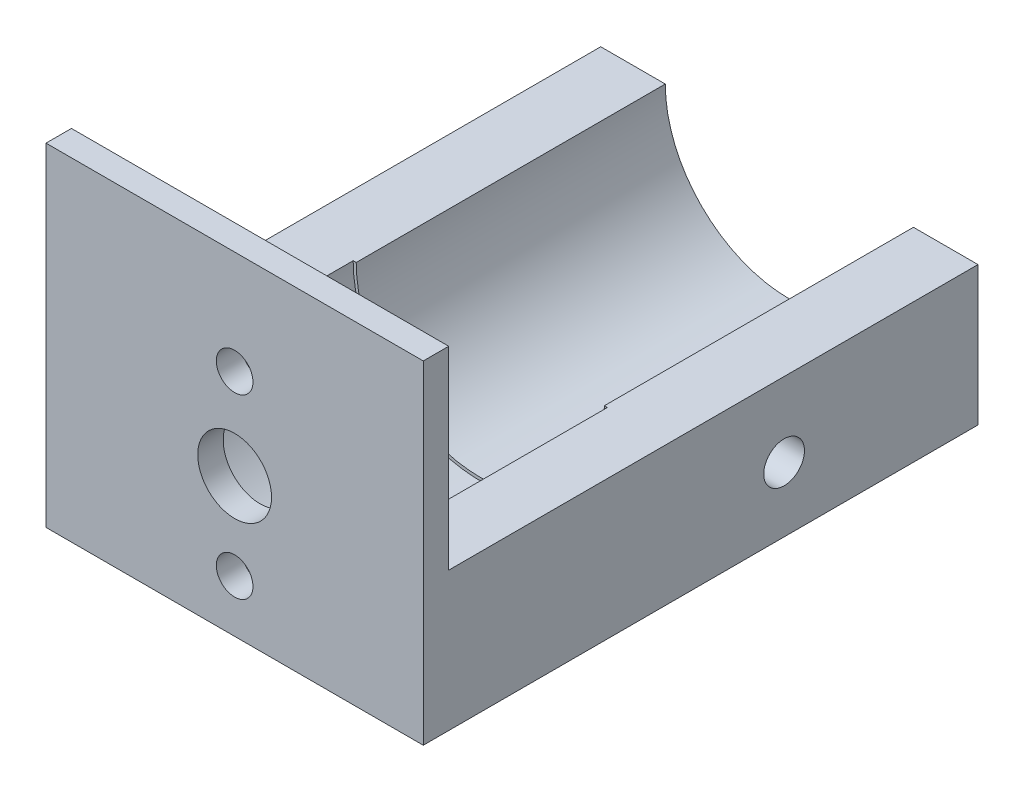
ISO-10303-21;
HEADER;
FILE_DESCRIPTION(('STEP AP214'),'2;1');
FILE_NAME('part.step','',(''),(''),'','','');
FILE_SCHEMA(('AUTOMOTIVE_DESIGN { 1 0 10303 214 1 1 1 1 }'));
ENDSEC;
DATA;
#1=APPLICATION_CONTEXT('core data for automotive mechanical design processes');
#2=APPLICATION_PROTOCOL_DEFINITION('international standard','automotive_design',2000,#1);
#3=PRODUCT_CONTEXT('',#1,'mechanical');
#4=PRODUCT('Part','Part','',(#3));
#5=PRODUCT_RELATED_PRODUCT_CATEGORY('part','',(#4));
#6=PRODUCT_DEFINITION_FORMATION('','',#4);
#7=PRODUCT_DEFINITION_CONTEXT('part definition',#1,'design');
#8=PRODUCT_DEFINITION('design','',#6,#7);
#9=PRODUCT_DEFINITION_SHAPE('','',#8);
#10=(LENGTH_UNIT() NAMED_UNIT(*) SI_UNIT(.MILLI.,.METRE.));
#11=(NAMED_UNIT(*) PLANE_ANGLE_UNIT() SI_UNIT($,.RADIAN.));
#12=(NAMED_UNIT(*) SI_UNIT($,.STERADIAN.) SOLID_ANGLE_UNIT());
#13=UNCERTAINTY_MEASURE_WITH_UNIT(LENGTH_MEASURE(1.E-05),#10,'distance_accuracy_value','');
#14=(GEOMETRIC_REPRESENTATION_CONTEXT(3) GLOBAL_UNCERTAINTY_ASSIGNED_CONTEXT((#13)) GLOBAL_UNIT_ASSIGNED_CONTEXT((#10,
#11,#12)) REPRESENTATION_CONTEXT('',''));
#15=CARTESIAN_POINT('',(0.,0.,0.));
#16=DIRECTION('',(0.,0.,1.));
#17=DIRECTION('',(1.,0.,0.));
#18=AXIS2_PLACEMENT_3D('',#15,#16,#17);
#19=CARTESIAN_POINT('',(5.23144906663831,19.05,30.364999976));
#20=DIRECTION('',(0.,0.,-1.));
#21=DIRECTION('',(-1.,0.,0.));
#22=AXIS2_PLACEMENT_3D('',#19,#20,#21);
#23=PLANE('',#22);
#24=CARTESIAN_POINT('',(5.23144901202831,19.05,30.364999976));
#25=DIRECTION('',(0.,0.,-1.));
#26=DIRECTION('',(-1.,0.,0.));
#27=AXIS2_PLACEMENT_3D('',#24,#25,#26);
#28=CIRCLE('',#27,12.4903981382124);
#29=CARTESIAN_POINT('',(17.7218471502407,19.05,30.364999976));
#30=VERTEX_POINT('',#29);
#31=CARTESIAN_POINT('',(-7.25894912618406,19.05,30.364999976));
#32=VERTEX_POINT('',#31);
#33=EDGE_CURVE('E58',#30,#32,#28,.T.);
#34=ORIENTED_EDGE('',*,*,#33,.F.);
#35=DIRECTION('',(-1.,0.,0.));
#36=VECTOR('',#35,1.);
#37=CARTESIAN_POINT('',(23.7638472582407,19.05,30.364999976));
#38=LINE('',#37,#36);
#39=CARTESIAN_POINT('',(17.4218472574807,19.05,30.364999976));
#40=VERTEX_POINT('',#39);
#41=EDGE_CURVE('E63',#30,#40,#38,.T.);
#42=ORIENTED_EDGE('',*,*,#41,.T.);
#43=CARTESIAN_POINT('',(5.23144906663831,19.05,30.364999976));
#44=DIRECTION('',(0.,0.,-1.));
#45=DIRECTION('',(-1.,0.,0.));
#46=AXIS2_PLACEMENT_3D('',#43,#44,#45);
#47=CIRCLE('',#46,12.1903981908424);
#48=CARTESIAN_POINT('',(-6.95894912420406,19.05,30.364999976));
#49=VERTEX_POINT('',#48);
#50=EDGE_CURVE('E100',#40,#49,#47,.T.);
#51=ORIENTED_EDGE('',*,*,#50,.T.);
#52=DIRECTION('',(-1.,0.,0.));
#53=VECTOR('',#52,1.);
#54=CARTESIAN_POINT('',(-13.3009491249641,19.05,30.364999976));
#55=LINE('',#54,#53);
#56=EDGE_CURVE('E195',#49,#32,#55,.T.);
#57=ORIENTED_EDGE('',*,*,#56,.T.);
#58=EDGE_LOOP('',(#34,#42,#51,#57));
#59=FACE_BOUND('',#58,.T.);
#60=ADVANCED_FACE('F43',(#59),#23,.F.);
#61=CARTESIAN_POINT('',(5.23144906663831,19.05,30.364999976));
#62=DIRECTION('',(0.,0.,-1.));
#63=DIRECTION('',(-1.,0.,0.));
#64=AXIS2_PLACEMENT_3D('',#61,#62,#63);
#65=CYLINDRICAL_SURFACE('',#64,12.1903981908424);
#66=CARTESIAN_POINT('',(5.23144906663831,19.05,0.));
#67=DIRECTION('',(0.,0.,-1.));
#68=DIRECTION('',(-1.,0.,0.));
#69=AXIS2_PLACEMENT_3D('',#66,#67,#68);
#70=CIRCLE('',#69,12.1903981908424);
#71=CARTESIAN_POINT('',(17.4218472574807,19.05,0.));
#72=VERTEX_POINT('',#71);
#73=CARTESIAN_POINT('',(-6.95894912420406,19.05,0.));
#74=VERTEX_POINT('',#73);
#75=EDGE_CURVE('E106',#72,#74,#70,.T.);
#76=ORIENTED_EDGE('',*,*,#75,.T.);
#77=DIRECTION('',(0.,0.,-1.));
#78=VECTOR('',#77,1.);
#79=CARTESIAN_POINT('',(-6.95894912420406,19.05,30.364999976));
#80=LINE('',#79,#78);
#81=EDGE_CURVE('E11',#49,#74,#80,.T.);
#82=ORIENTED_EDGE('',*,*,#81,.F.);
#83=ORIENTED_EDGE('',*,*,#50,.F.);
#84=DIRECTION('',(0.,0.,-1.));
#85=VECTOR('',#84,1.);
#86=CARTESIAN_POINT('',(17.4218472574807,19.05,30.364999976));
#87=LINE('',#86,#85);
#88=EDGE_CURVE('E92',#40,#72,#87,.T.);
#89=ORIENTED_EDGE('',*,*,#88,.T.);
#90=EDGE_LOOP('',(#76,#82,#83,#89));
#91=FACE_BOUND('',#90,.T.);
#92=ADVANCED_FACE('F45',(#91),#65,.F.);
#93=CARTESIAN_POINT('',(-13.3009491249641,19.05,30.364999976));
#94=DIRECTION('',(0.,-1.,0.));
#95=DIRECTION('',(0.,0.,-1.));
#96=AXIS2_PLACEMENT_3D('',#93,#94,#95);
#97=PLANE('',#96);
#98=DIRECTION('',(-1.,0.,0.));
#99=VECTOR('',#98,1.);
#100=CARTESIAN_POINT('',(-13.3009491249641,19.05,0.));
#101=LINE('',#100,#99);
#102=CARTESIAN_POINT('',(-13.3009491249641,19.05,0.));
#103=VERTEX_POINT('',#102);
#104=EDGE_CURVE('E110',#74,#103,#101,.T.);
#105=ORIENTED_EDGE('',*,*,#104,.T.);
#106=DIRECTION('',(0.,0.,-1.));
#107=VECTOR('',#106,1.);
#108=CARTESIAN_POINT('',(-13.3009491249641,19.05,30.364999976));
#109=LINE('',#108,#107);
#110=CARTESIAN_POINT('',(-13.3009491249641,19.05,51.999999886));
#111=VERTEX_POINT('',#110);
#112=EDGE_CURVE('E51',#111,#103,#109,.T.);
#113=ORIENTED_EDGE('',*,*,#112,.F.);
#114=DIRECTION('',(-1.,0.,0.));
#115=VECTOR('',#114,1.);
#116=CARTESIAN_POINT('',(-13.3009491249641,19.05,51.999999886));
#117=LINE('',#116,#115);
#118=CARTESIAN_POINT('',(-7.25894912618406,19.05,51.999999886));
#119=VERTEX_POINT('',#118);
#120=EDGE_CURVE('E184',#119,#111,#117,.T.);
#121=ORIENTED_EDGE('',*,*,#120,.F.);
#122=DIRECTION('',(0.,0.,-1.));
#123=VECTOR('',#122,1.);
#124=CARTESIAN_POINT('',(-7.25894912618406,19.05,51.999999886));
#125=LINE('',#124,#123);
#126=EDGE_CURVE('E116',#119,#32,#125,.T.);
#127=ORIENTED_EDGE('',*,*,#126,.T.);
#128=ORIENTED_EDGE('',*,*,#56,.F.);
#129=ORIENTED_EDGE('',*,*,#81,.T.);
#130=EDGE_LOOP('',(#105,#113,#121,#127,#128,#129));
#131=FACE_BOUND('',#130,.T.);
#132=ADVANCED_FACE('F203',(#131),#97,.F.);
#133=CARTESIAN_POINT('',(-13.3009491249641,19.05,30.364999976));
#134=DIRECTION('',(1.,0.,0.));
#135=DIRECTION('',(0.,1.,0.));
#136=AXIS2_PLACEMENT_3D('',#133,#134,#135);
#137=PLANE('',#136);
#138=CARTESIAN_POINT('',(-13.3009491249641,11.75,19.05));
#139=DIRECTION('',(-1.,0.,0.));
#140=DIRECTION('',(0.,-1.,0.));
#141=AXIS2_PLACEMENT_3D('',#138,#139,#140);
#142=CIRCLE('',#141,2.000000064);
#143=CARTESIAN_POINT('',(-13.3009491249641,9.749999936,19.05));
#144=VERTEX_POINT('',#143);
#145=EDGE_CURVE('E271',#144,#144,#142,.T.);
#146=ORIENTED_EDGE('',*,*,#145,.F.);
#147=EDGE_LOOP('',(#146));
#148=FACE_BOUND('',#147,.T.);
#149=DIRECTION('',(0.,-1.,0.));
#150=VECTOR('',#149,1.);
#151=CARTESIAN_POINT('',(-13.3009491249641,19.05,0.));
#152=LINE('',#151,#150);
#153=CARTESIAN_POINT('',(-13.3009491249641,5.4,0.));
#154=VERTEX_POINT('',#153);
#155=EDGE_CURVE('E113',#103,#154,#152,.T.);
#156=ORIENTED_EDGE('',*,*,#155,.T.);
#157=DIRECTION('',(0.,0.,-1.));
#158=VECTOR('',#157,1.);
#159=CARTESIAN_POINT('',(-13.3009491249641,5.4,30.364999976));
#160=LINE('',#159,#158);
#161=CARTESIAN_POINT('',(-13.3009491249641,5.4,54.499999886));
#162=VERTEX_POINT('',#161);
#163=EDGE_CURVE('E129',#162,#154,#160,.T.);
#164=ORIENTED_EDGE('',*,*,#163,.F.);
#165=DIRECTION('',(0.,-1.,0.));
#166=VECTOR('',#165,1.);
#167=CARTESIAN_POINT('',(-13.3009491249641,5.4,54.499999886));
#168=LINE('',#167,#166);
#169=CARTESIAN_POINT('',(-13.3009491249641,38.1,54.499999886));
#170=VERTEX_POINT('',#169);
#171=EDGE_CURVE('E171',#170,#162,#168,.T.);
#172=ORIENTED_EDGE('',*,*,#171,.F.);
#173=DIRECTION('',(0.,0.,-1.));
#174=VECTOR('',#173,1.);
#175=CARTESIAN_POINT('',(-13.3009491249641,38.1,54.499999886));
#176=LINE('',#175,#174);
#177=CARTESIAN_POINT('',(-13.3009491249641,38.1,51.999999886));
#178=VERTEX_POINT('',#177);
#179=EDGE_CURVE('E169',#170,#178,#176,.T.);
#180=ORIENTED_EDGE('',*,*,#179,.T.);
#181=DIRECTION('',(0.,-1.,0.));
#182=VECTOR('',#181,1.);
#183=CARTESIAN_POINT('',(-13.3009491249641,5.4,51.999999886));
#184=LINE('',#183,#182);
#185=EDGE_CURVE('E140',#178,#111,#184,.T.);
#186=ORIENTED_EDGE('',*,*,#185,.T.);
#187=ORIENTED_EDGE('',*,*,#112,.T.);
#188=EDGE_LOOP('',(#156,#164,#172,#180,#186,#187));
#189=FACE_BOUND('',#188,.T.);
#190=ADVANCED_FACE('F135',(#148,#189),#137,.F.);
#191=CARTESIAN_POINT('',(-13.3009491249641,5.4,30.364999976));
#192=DIRECTION('',(0.,1.,0.));
#193=DIRECTION('',(0.,0.,1.));
#194=AXIS2_PLACEMENT_3D('',#191,#192,#193);
#195=PLANE('',#194);
#196=CARTESIAN_POINT('',(18.6838472582407,5.4,48.149999886));
#197=DIRECTION('',(0.,-1.,0.));
#198=DIRECTION('',(0.,0.,-1.));
#199=AXIS2_PLACEMENT_3D('',#196,#197,#198);
#200=CIRCLE('',#199,2.);
#201=CARTESIAN_POINT('',(18.6838472582407,5.4,46.149999886));
#202=VERTEX_POINT('',#201);
#203=EDGE_CURVE('E250',#202,#202,#200,.T.);
#204=ORIENTED_EDGE('',*,*,#203,.F.);
#205=EDGE_LOOP('',(#204));
#206=FACE_BOUND('',#205,.T.);
#207=CARTESIAN_POINT('',(-8.22094912496406,5.4,6.35));
#208=DIRECTION('',(0.,-1.,0.));
#209=DIRECTION('',(0.,0.,-1.));
#210=AXIS2_PLACEMENT_3D('',#207,#208,#209);
#211=CIRCLE('',#210,2.);
#212=CARTESIAN_POINT('',(-8.22094912496406,5.4,4.35));
#213=VERTEX_POINT('',#212);
#214=EDGE_CURVE('E256',#213,#213,#211,.T.);
#215=ORIENTED_EDGE('',*,*,#214,.F.);
#216=EDGE_LOOP('',(#215));
#217=FACE_BOUND('',#216,.T.);
#218=CARTESIAN_POINT('',(18.6838472582407,5.4,6.35));
#219=DIRECTION('',(0.,-1.,0.));
#220=DIRECTION('',(0.,0.,-1.));
#221=AXIS2_PLACEMENT_3D('',#218,#219,#220);
#222=CIRCLE('',#221,2.);
#223=CARTESIAN_POINT('',(18.6838472582407,5.4,4.35));
#224=VERTEX_POINT('',#223);
#225=EDGE_CURVE('E257',#224,#224,#222,.T.);
#226=ORIENTED_EDGE('',*,*,#225,.F.);
#227=EDGE_LOOP('',(#226));
#228=FACE_BOUND('',#227,.T.);
#229=CARTESIAN_POINT('',(-8.22094912496406,5.4,48.149999886));
#230=DIRECTION('',(0.,-1.,0.));
#231=DIRECTION('',(0.,0.,-1.));
#232=AXIS2_PLACEMENT_3D('',#229,#230,#231);
#233=CIRCLE('',#232,2.);
#234=CARTESIAN_POINT('',(-8.22094912496406,5.4,46.149999886));
#235=VERTEX_POINT('',#234);
#236=EDGE_CURVE('E247',#235,#235,#233,.T.);
#237=ORIENTED_EDGE('',*,*,#236,.F.);
#238=EDGE_LOOP('',(#237));
#239=FACE_BOUND('',#238,.T.);
#240=DIRECTION('',(1.,0.,0.));
#241=VECTOR('',#240,1.);
#242=CARTESIAN_POINT('',(-13.3009491249641,5.4,0.));
#243=LINE('',#242,#241);
#244=CARTESIAN_POINT('',(23.7638472582407,5.4,0.));
#245=VERTEX_POINT('',#244);
#246=EDGE_CURVE('E122',#154,#245,#243,.T.);
#247=ORIENTED_EDGE('',*,*,#246,.T.);
#248=DIRECTION('',(0.,0.,-1.));
#249=VECTOR('',#248,1.);
#250=CARTESIAN_POINT('',(23.7638472582407,5.4,30.364999976));
#251=LINE('',#250,#249);
#252=CARTESIAN_POINT('',(23.7638472582407,5.4,54.499999886));
#253=VERTEX_POINT('',#252);
#254=EDGE_CURVE('E126',#253,#245,#251,.T.);
#255=ORIENTED_EDGE('',*,*,#254,.F.);
#256=DIRECTION('',(1.,0.,0.));
#257=VECTOR('',#256,1.);
#258=CARTESIAN_POINT('',(-13.3009491249641,5.4,54.499999886));
#259=LINE('',#258,#257);
#260=EDGE_CURVE('E167',#162,#253,#259,.T.);
#261=ORIENTED_EDGE('',*,*,#260,.F.);
#262=ORIENTED_EDGE('',*,*,#163,.T.);
#263=EDGE_LOOP('',(#247,#255,#261,#262));
#264=FACE_BOUND('',#263,.T.);
#265=ADVANCED_FACE('F147',(#206,#217,#228,#239,#264),#195,.F.);
#266=CARTESIAN_POINT('',(23.7638472582407,19.05,30.364999976));
#267=DIRECTION('',(-1.,0.,0.));
#268=DIRECTION('',(0.,-1.,0.));
#269=AXIS2_PLACEMENT_3D('',#266,#267,#268);
#270=PLANE('',#269);
#271=CARTESIAN_POINT('',(23.7638472582407,11.75,19.05));
#272=DIRECTION('',(1.,0.,0.));
#273=DIRECTION('',(0.,0.,-1.));
#274=AXIS2_PLACEMENT_3D('',#271,#272,#273);
#275=CIRCLE('',#274,2.);
#276=CARTESIAN_POINT('',(23.7638472582407,11.75,17.05));
#277=VERTEX_POINT('',#276);
#278=EDGE_CURVE('E277',#277,#277,#275,.T.);
#279=ORIENTED_EDGE('',*,*,#278,.F.);
#280=EDGE_LOOP('',(#279));
#281=FACE_BOUND('',#280,.T.);
#282=DIRECTION('',(0.,1.,0.));
#283=VECTOR('',#282,1.);
#284=CARTESIAN_POINT('',(23.7638472582407,19.05,0.));
#285=LINE('',#284,#283);
#286=CARTESIAN_POINT('',(23.7638472582407,19.05,0.));
#287=VERTEX_POINT('',#286);
#288=EDGE_CURVE('E101',#245,#287,#285,.T.);
#289=ORIENTED_EDGE('',*,*,#288,.T.);
#290=DIRECTION('',(0.,0.,-1.));
#291=VECTOR('',#290,1.);
#292=CARTESIAN_POINT('',(23.7638472582407,19.05,30.364999976));
#293=LINE('',#292,#291);
#294=CARTESIAN_POINT('',(23.7638472582407,19.05,51.999999886));
#295=VERTEX_POINT('',#294);
#296=EDGE_CURVE('E96',#295,#287,#293,.T.);
#297=ORIENTED_EDGE('',*,*,#296,.F.);
#298=DIRECTION('',(0.,1.,0.));
#299=VECTOR('',#298,1.);
#300=CARTESIAN_POINT('',(23.7638472582407,5.4,51.999999886));
#301=LINE('',#300,#299);
#302=CARTESIAN_POINT('',(23.7638472582407,38.1,51.999999886));
#303=VERTEX_POINT('',#302);
#304=EDGE_CURVE('E176',#295,#303,#301,.T.);
#305=ORIENTED_EDGE('',*,*,#304,.T.);
#306=DIRECTION('',(0.,0.,-1.));
#307=VECTOR('',#306,1.);
#308=CARTESIAN_POINT('',(23.7638472582407,38.1,54.499999886));
#309=LINE('',#308,#307);
#310=CARTESIAN_POINT('',(23.7638472582407,38.1,54.499999886));
#311=VERTEX_POINT('',#310);
#312=EDGE_CURVE('E160',#311,#303,#309,.T.);
#313=ORIENTED_EDGE('',*,*,#312,.F.);
#314=DIRECTION('',(0.,1.,0.));
#315=VECTOR('',#314,1.);
#316=CARTESIAN_POINT('',(23.7638472582407,5.4,54.499999886));
#317=LINE('',#316,#315);
#318=EDGE_CURVE('E156',#253,#311,#317,.T.);
#319=ORIENTED_EDGE('',*,*,#318,.F.);
#320=ORIENTED_EDGE('',*,*,#254,.T.);
#321=EDGE_LOOP('',(#289,#297,#305,#313,#319,#320));
#322=FACE_BOUND('',#321,.T.);
#323=ADVANCED_FACE('F153',(#281,#322),#270,.F.);
#324=CARTESIAN_POINT('',(23.7638472582407,19.05,30.364999976));
#325=DIRECTION('',(0.,-1.,0.));
#326=DIRECTION('',(0.,0.,-1.));
#327=AXIS2_PLACEMENT_3D('',#324,#325,#326);
#328=PLANE('',#327);
#329=DIRECTION('',(-1.,0.,0.));
#330=VECTOR('',#329,1.);
#331=CARTESIAN_POINT('',(23.7638472582407,19.05,0.));
#332=LINE('',#331,#330);
#333=EDGE_CURVE('E89',#287,#72,#332,.T.);
#334=ORIENTED_EDGE('',*,*,#333,.T.);
#335=ORIENTED_EDGE('',*,*,#88,.F.);
#336=ORIENTED_EDGE('',*,*,#41,.F.);
#337=DIRECTION('',(0.,0.,-1.));
#338=VECTOR('',#337,1.);
#339=CARTESIAN_POINT('',(17.7218471502407,19.05,51.999999886));
#340=LINE('',#339,#338);
#341=CARTESIAN_POINT('',(17.7218471502407,19.05,51.999999886));
#342=VERTEX_POINT('',#341);
#343=EDGE_CURVE('E111',#342,#30,#340,.T.);
#344=ORIENTED_EDGE('',*,*,#343,.F.);
#345=DIRECTION('',(-1.,0.,0.));
#346=VECTOR('',#345,1.);
#347=CARTESIAN_POINT('',(17.7218471502407,19.05,51.999999886));
#348=LINE('',#347,#346);
#349=EDGE_CURVE('E186',#295,#342,#348,.T.);
#350=ORIENTED_EDGE('',*,*,#349,.F.);
#351=ORIENTED_EDGE('',*,*,#296,.T.);
#352=EDGE_LOOP('',(#334,#335,#336,#344,#350,#351));
#353=FACE_BOUND('',#352,.T.);
#354=ADVANCED_FACE('F91',(#353),#328,.F.);
#355=CARTESIAN_POINT('',(5.23144906663831,19.05,0.));
#356=DIRECTION('',(0.,0.,-1.));
#357=DIRECTION('',(-1.,0.,0.));
#358=AXIS2_PLACEMENT_3D('',#355,#356,#357);
#359=PLANE('',#358);
#360=ORIENTED_EDGE('',*,*,#75,.F.);
#361=ORIENTED_EDGE('',*,*,#333,.F.);
#362=ORIENTED_EDGE('',*,*,#288,.F.);
#363=ORIENTED_EDGE('',*,*,#246,.F.);
#364=ORIENTED_EDGE('',*,*,#155,.F.);
#365=ORIENTED_EDGE('',*,*,#104,.F.);
#366=EDGE_LOOP('',(#360,#361,#362,#363,#364,#365));
#367=FACE_BOUND('',#366,.T.);
#368=ADVANCED_FACE('F108',(#367),#359,.T.);
#369=CARTESIAN_POINT('',(5.23144901202831,19.05,51.999999886));
#370=DIRECTION('',(0.,0.,-1.));
#371=DIRECTION('',(-1.,0.,0.));
#372=AXIS2_PLACEMENT_3D('',#369,#370,#371);
#373=CYLINDRICAL_SURFACE('',#372,12.4903981382124);
#374=ORIENTED_EDGE('',*,*,#33,.T.);
#375=ORIENTED_EDGE('',*,*,#126,.F.);
#376=CARTESIAN_POINT('',(5.23144901202831,19.05,51.999999886));
#377=DIRECTION('',(0.,0.,-1.));
#378=DIRECTION('',(-1.,0.,0.));
#379=AXIS2_PLACEMENT_3D('',#376,#377,#378);
#380=CIRCLE('',#379,12.4903981382124);
#381=EDGE_CURVE('E189',#342,#119,#380,.T.);
#382=ORIENTED_EDGE('',*,*,#381,.F.);
#383=ORIENTED_EDGE('',*,*,#343,.T.);
#384=EDGE_LOOP('',(#374,#375,#382,#383));
#385=FACE_BOUND('',#384,.T.);
#386=ADVANCED_FACE('F200',(#385),#373,.F.);
#387=CARTESIAN_POINT('',(0.,0.,51.999999886));
#388=DIRECTION('',(0.,0.,-1.));
#389=DIRECTION('',(-1.,0.,0.));
#390=AXIS2_PLACEMENT_3D('',#387,#388,#389);
#391=PLANE('',#390);
#392=CARTESIAN_POINT('',(5.23144909324068,10.541,51.999999886));
#393=DIRECTION('',(0.,0.,1.));
#394=DIRECTION('',(1.,0.,0.));
#395=AXIS2_PLACEMENT_3D('',#392,#393,#394);
#396=CIRCLE('',#395,1.8);
#397=CARTESIAN_POINT('',(7.03144909324068,10.541,51.999999886));
#398=VERTEX_POINT('',#397);
#399=EDGE_CURVE('E235',#398,#398,#396,.T.);
#400=ORIENTED_EDGE('',*,*,#399,.T.);
#401=EDGE_LOOP('',(#400));
#402=FACE_BOUND('',#401,.T.);
#403=CARTESIAN_POINT('',(5.23144909324067,19.05,51.999999886));
#404=DIRECTION('',(0.,0.,1.));
#405=DIRECTION('',(1.,0.,0.));
#406=AXIS2_PLACEMENT_3D('',#403,#404,#405);
#407=CIRCLE('',#406,3.625);
#408=CARTESIAN_POINT('',(8.85644909324068,19.05,51.999999886));
#409=VERTEX_POINT('',#408);
#410=EDGE_CURVE('E229',#409,#409,#407,.T.);
#411=ORIENTED_EDGE('',*,*,#410,.T.);
#412=EDGE_LOOP('',(#411));
#413=FACE_BOUND('',#412,.T.);
#414=CARTESIAN_POINT('',(5.23144909324067,27.94,51.999999886));
#415=DIRECTION('',(0.,0.,1.));
#416=DIRECTION('',(1.,0.,0.));
#417=AXIS2_PLACEMENT_3D('',#414,#415,#416);
#418=CIRCLE('',#417,1.8);
#419=CARTESIAN_POINT('',(7.03144909324067,27.94,51.999999886));
#420=VERTEX_POINT('',#419);
#421=EDGE_CURVE('E241',#420,#420,#418,.T.);
#422=ORIENTED_EDGE('',*,*,#421,.T.);
#423=EDGE_LOOP('',(#422));
#424=FACE_BOUND('',#423,.T.);
#425=ORIENTED_EDGE('',*,*,#381,.T.);
#426=ORIENTED_EDGE('',*,*,#120,.T.);
#427=ORIENTED_EDGE('',*,*,#185,.F.);
#428=DIRECTION('',(-1.,0.,0.));
#429=VECTOR('',#428,1.);
#430=CARTESIAN_POINT('',(-13.3009491249641,38.1,51.999999886));
#431=LINE('',#430,#429);
#432=EDGE_CURVE('E179',#303,#178,#431,.T.);
#433=ORIENTED_EDGE('',*,*,#432,.F.);
#434=ORIENTED_EDGE('',*,*,#304,.F.);
#435=ORIENTED_EDGE('',*,*,#349,.T.);
#436=EDGE_LOOP('',(#425,#426,#427,#433,#434,#435));
#437=FACE_BOUND('',#436,.T.);
#438=ADVANCED_FACE('F207',(#402,#413,#424,#437),#391,.T.);
#439=CARTESIAN_POINT('',(0.,0.,54.499999886));
#440=DIRECTION('',(0.,0.,-1.));
#441=DIRECTION('',(-1.,0.,0.));
#442=AXIS2_PLACEMENT_3D('',#439,#440,#441);
#443=PLANE('',#442);
#444=ORIENTED_EDGE('',*,*,#171,.T.);
#445=ORIENTED_EDGE('',*,*,#260,.T.);
#446=ORIENTED_EDGE('',*,*,#318,.T.);
#447=DIRECTION('',(-1.,0.,0.));
#448=VECTOR('',#447,1.);
#449=CARTESIAN_POINT('',(-13.3009491249641,38.1,54.499999886));
#450=LINE('',#449,#448);
#451=EDGE_CURVE('E166',#311,#170,#450,.T.);
#452=ORIENTED_EDGE('',*,*,#451,.T.);
#453=EDGE_LOOP('',(#444,#445,#446,#452));
#454=FACE_BOUND('',#453,.T.);
#455=CARTESIAN_POINT('',(5.23144909324067,19.05,54.499999886));
#456=DIRECTION('',(0.,0.,1.));
#457=DIRECTION('',(1.,0.,0.));
#458=AXIS2_PLACEMENT_3D('',#455,#456,#457);
#459=CIRCLE('',#458,3.625);
#460=CARTESIAN_POINT('',(8.85644909324068,19.05,54.499999886));
#461=VERTEX_POINT('',#460);
#462=EDGE_CURVE('E177',#461,#461,#459,.T.);
#463=ORIENTED_EDGE('',*,*,#462,.F.);
#464=EDGE_LOOP('',(#463));
#465=FACE_BOUND('',#464,.T.);
#466=CARTESIAN_POINT('',(5.23144909324068,10.541,54.499999886));
#467=DIRECTION('',(0.,0.,1.));
#468=DIRECTION('',(1.,0.,0.));
#469=AXIS2_PLACEMENT_3D('',#466,#467,#468);
#470=CIRCLE('',#469,1.8);
#471=CARTESIAN_POINT('',(7.03144909324068,10.541,54.499999886));
#472=VERTEX_POINT('',#471);
#473=EDGE_CURVE('E232',#472,#472,#470,.T.);
#474=ORIENTED_EDGE('',*,*,#473,.F.);
#475=EDGE_LOOP('',(#474));
#476=FACE_BOUND('',#475,.T.);
#477=CARTESIAN_POINT('',(5.23144909324067,27.94,54.499999886));
#478=DIRECTION('',(0.,0.,1.));
#479=DIRECTION('',(1.,0.,0.));
#480=AXIS2_PLACEMENT_3D('',#477,#478,#479);
#481=CIRCLE('',#480,1.8);
#482=CARTESIAN_POINT('',(7.03144909324067,27.94,54.499999886));
#483=VERTEX_POINT('',#482);
#484=EDGE_CURVE('E238',#483,#483,#481,.T.);
#485=ORIENTED_EDGE('',*,*,#484,.F.);
#486=EDGE_LOOP('',(#485));
#487=FACE_BOUND('',#486,.T.);
#488=ADVANCED_FACE('F224',(#454,#465,#476,#487),#443,.F.);
#489=CARTESIAN_POINT('',(-13.3009491249641,38.1,54.499999886));
#490=DIRECTION('',(0.,-1.,0.));
#491=DIRECTION('',(0.,0.,-1.));
#492=AXIS2_PLACEMENT_3D('',#489,#490,#491);
#493=PLANE('',#492);
#494=ORIENTED_EDGE('',*,*,#432,.T.);
#495=ORIENTED_EDGE('',*,*,#179,.F.);
#496=ORIENTED_EDGE('',*,*,#451,.F.);
#497=ORIENTED_EDGE('',*,*,#312,.T.);
#498=EDGE_LOOP('',(#494,#495,#496,#497));
#499=FACE_BOUND('',#498,.T.);
#500=ADVANCED_FACE('F219',(#499),#493,.F.);
#501=CARTESIAN_POINT('',(5.23144909324067,19.05,54.499999886));
#502=DIRECTION('',(0.,0.,-1.));
#503=DIRECTION('',(-1.,0.,0.));
#504=AXIS2_PLACEMENT_3D('',#501,#502,#503);
#505=CYLINDRICAL_SURFACE('',#504,3.625);
#506=ORIENTED_EDGE('',*,*,#462,.T.);
#507=EDGE_LOOP('',(#506));
#508=FACE_BOUND('',#507,.T.);
#509=ORIENTED_EDGE('',*,*,#410,.F.);
#510=EDGE_LOOP('',(#509));
#511=FACE_BOUND('',#510,.T.);
#512=ADVANCED_FACE('F327',(#508,#511),#505,.F.);
#513=CARTESIAN_POINT('',(5.23144909324068,10.541,54.499999886));
#514=DIRECTION('',(0.,0.,-1.));
#515=DIRECTION('',(-1.,0.,0.));
#516=AXIS2_PLACEMENT_3D('',#513,#514,#515);
#517=CYLINDRICAL_SURFACE('',#516,1.8);
#518=ORIENTED_EDGE('',*,*,#473,.T.);
#519=EDGE_LOOP('',(#518));
#520=FACE_BOUND('',#519,.T.);
#521=ORIENTED_EDGE('',*,*,#399,.F.);
#522=EDGE_LOOP('',(#521));
#523=FACE_BOUND('',#522,.T.);
#524=ADVANCED_FACE('F331',(#520,#523),#517,.F.);
#525=CARTESIAN_POINT('',(5.23144909324067,27.94,54.499999886));
#526=DIRECTION('',(0.,0.,-1.));
#527=DIRECTION('',(-1.,0.,0.));
#528=AXIS2_PLACEMENT_3D('',#525,#526,#527);
#529=CYLINDRICAL_SURFACE('',#528,1.8);
#530=ORIENTED_EDGE('',*,*,#484,.T.);
#531=EDGE_LOOP('',(#530));
#532=FACE_BOUND('',#531,.T.);
#533=ORIENTED_EDGE('',*,*,#421,.F.);
#534=EDGE_LOOP('',(#533));
#535=FACE_BOUND('',#534,.T.);
#536=ADVANCED_FACE('F336',(#532,#535),#529,.F.);
#537=CARTESIAN_POINT('',(-8.22094912496406,12.4,48.149999886));
#538=DIRECTION('',(0.,-1.,0.));
#539=DIRECTION('',(0.,0.,-1.));
#540=AXIS2_PLACEMENT_3D('',#537,#538,#539);
#541=CYLINDRICAL_SURFACE('',#540,2.);
#542=CARTESIAN_POINT('',(-8.22094912496406,12.4,48.149999886));
#543=DIRECTION('',(0.,-1.,0.));
#544=DIRECTION('',(0.,0.,-1.));
#545=AXIS2_PLACEMENT_3D('',#542,#543,#544);
#546=CIRCLE('',#545,2.);
#547=CARTESIAN_POINT('',(-8.22094912496406,12.4,46.149999886));
#548=VERTEX_POINT('',#547);
#549=EDGE_CURVE('E244',#548,#548,#546,.T.);
#550=ORIENTED_EDGE('',*,*,#549,.F.);
#551=EDGE_LOOP('',(#550));
#552=FACE_BOUND('',#551,.T.);
#553=ORIENTED_EDGE('',*,*,#236,.T.);
#554=EDGE_LOOP('',(#553));
#555=FACE_BOUND('',#554,.T.);
#556=ADVANCED_FACE('F343',(#552,#555),#541,.F.);
#557=CARTESIAN_POINT('',(-8.22094912496406,12.4,48.149999886));
#558=DIRECTION('',(0.,-1.,0.));
#559=DIRECTION('',(0.,0.,-1.));
#560=AXIS2_PLACEMENT_3D('',#557,#558,#559);
#561=PLANE('',#560);
#562=ORIENTED_EDGE('',*,*,#549,.T.);
#563=EDGE_LOOP('',(#562));
#564=FACE_BOUND('',#563,.T.);
#565=ADVANCED_FACE('F347',(#564),#561,.T.);
#566=CARTESIAN_POINT('',(18.6838472582407,12.4,6.35));
#567=DIRECTION('',(0.,-1.,0.));
#568=DIRECTION('',(0.,0.,-1.));
#569=AXIS2_PLACEMENT_3D('',#566,#567,#568);
#570=CYLINDRICAL_SURFACE('',#569,2.);
#571=CARTESIAN_POINT('',(18.6838472582407,12.4,6.35));
#572=DIRECTION('',(0.,-1.,0.));
#573=DIRECTION('',(0.,0.,-1.));
#574=AXIS2_PLACEMENT_3D('',#571,#572,#573);
#575=CIRCLE('',#574,2.);
#576=CARTESIAN_POINT('',(18.6838472582407,12.4,4.35));
#577=VERTEX_POINT('',#576);
#578=EDGE_CURVE('E265',#577,#577,#575,.T.);
#579=ORIENTED_EDGE('',*,*,#578,.F.);
#580=EDGE_LOOP('',(#579));
#581=FACE_BOUND('',#580,.T.);
#582=ORIENTED_EDGE('',*,*,#225,.T.);
#583=EDGE_LOOP('',(#582));
#584=FACE_BOUND('',#583,.T.);
#585=ADVANCED_FACE('F351',(#581,#584),#570,.F.);
#586=CARTESIAN_POINT('',(18.6838472582407,12.4,6.35));
#587=DIRECTION('',(0.,-1.,0.));
#588=DIRECTION('',(0.,0.,-1.));
#589=AXIS2_PLACEMENT_3D('',#586,#587,#588);
#590=PLANE('',#589);
#591=ORIENTED_EDGE('',*,*,#578,.T.);
#592=EDGE_LOOP('',(#591));
#593=FACE_BOUND('',#592,.T.);
#594=ADVANCED_FACE('F361',(#593),#590,.T.);
#595=CARTESIAN_POINT('',(-8.22094912496406,12.4,6.35));
#596=DIRECTION('',(0.,-1.,0.));
#597=DIRECTION('',(0.,0.,-1.));
#598=AXIS2_PLACEMENT_3D('',#595,#596,#597);
#599=CYLINDRICAL_SURFACE('',#598,2.);
#600=CARTESIAN_POINT('',(-8.22094912496406,12.4,6.35));
#601=DIRECTION('',(0.,-1.,0.));
#602=DIRECTION('',(0.,0.,-1.));
#603=AXIS2_PLACEMENT_3D('',#600,#601,#602);
#604=CIRCLE('',#603,2.);
#605=CARTESIAN_POINT('',(-8.22094912496406,12.4,4.35));
#606=VERTEX_POINT('',#605);
#607=EDGE_CURVE('E253',#606,#606,#604,.T.);
#608=ORIENTED_EDGE('',*,*,#607,.F.);
#609=EDGE_LOOP('',(#608));
#610=FACE_BOUND('',#609,.T.);
#611=ORIENTED_EDGE('',*,*,#214,.T.);
#612=EDGE_LOOP('',(#611));
#613=FACE_BOUND('',#612,.T.);
#614=ADVANCED_FACE('F357',(#610,#613),#599,.F.);
#615=CARTESIAN_POINT('',(-8.22094912496406,12.4,6.35));
#616=DIRECTION('',(0.,-1.,0.));
#617=DIRECTION('',(0.,0.,-1.));
#618=AXIS2_PLACEMENT_3D('',#615,#616,#617);
#619=PLANE('',#618);
#620=ORIENTED_EDGE('',*,*,#607,.T.);
#621=EDGE_LOOP('',(#620));
#622=FACE_BOUND('',#621,.T.);
#623=ADVANCED_FACE('F353',(#622),#619,.T.);
#624=CARTESIAN_POINT('',(18.6838472582407,12.4,48.149999886));
#625=DIRECTION('',(0.,-1.,0.));
#626=DIRECTION('',(0.,0.,-1.));
#627=AXIS2_PLACEMENT_3D('',#624,#625,#626);
#628=CYLINDRICAL_SURFACE('',#627,2.);
#629=CARTESIAN_POINT('',(18.6838472582407,12.4,48.149999886));
#630=DIRECTION('',(0.,-1.,0.));
#631=DIRECTION('',(0.,0.,-1.));
#632=AXIS2_PLACEMENT_3D('',#629,#630,#631);
#633=CIRCLE('',#632,2.);
#634=CARTESIAN_POINT('',(18.6838472582407,12.4,46.149999886));
#635=VERTEX_POINT('',#634);
#636=EDGE_CURVE('E260',#635,#635,#633,.T.);
#637=ORIENTED_EDGE('',*,*,#636,.F.);
#638=EDGE_LOOP('',(#637));
#639=FACE_BOUND('',#638,.T.);
#640=ORIENTED_EDGE('',*,*,#203,.T.);
#641=EDGE_LOOP('',(#640));
#642=FACE_BOUND('',#641,.T.);
#643=ADVANCED_FACE('F356',(#639,#642),#628,.F.);
#644=CARTESIAN_POINT('',(18.6838472582407,12.4,48.149999886));
#645=DIRECTION('',(0.,-1.,0.));
#646=DIRECTION('',(0.,0.,-1.));
#647=AXIS2_PLACEMENT_3D('',#644,#645,#646);
#648=PLANE('',#647);
#649=ORIENTED_EDGE('',*,*,#636,.T.);
#650=EDGE_LOOP('',(#649));
#651=FACE_BOUND('',#650,.T.);
#652=ADVANCED_FACE('F363',(#651),#648,.T.);
#653=CARTESIAN_POINT('',(-6.30094912496406,11.75,19.05));
#654=DIRECTION('',(-1.,0.,0.));
#655=DIRECTION('',(0.,-1.,0.));
#656=AXIS2_PLACEMENT_3D('',#653,#654,#655);
#657=CYLINDRICAL_SURFACE('',#656,2.000000064);
#658=CARTESIAN_POINT('',(-6.30094912496406,11.75,19.05));
#659=DIRECTION('',(-1.,0.,0.));
#660=DIRECTION('',(0.,-1.,0.));
#661=AXIS2_PLACEMENT_3D('',#658,#659,#660);
#662=CIRCLE('',#661,2.000000064);
#663=CARTESIAN_POINT('',(-6.30094912496406,9.749999936,19.05));
#664=VERTEX_POINT('',#663);
#665=EDGE_CURVE('E268',#664,#664,#662,.T.);
#666=ORIENTED_EDGE('',*,*,#665,.F.);
#667=EDGE_LOOP('',(#666));
#668=FACE_BOUND('',#667,.T.);
#669=ORIENTED_EDGE('',*,*,#145,.T.);
#670=EDGE_LOOP('',(#669));
#671=FACE_BOUND('',#670,.T.);
#672=ADVANCED_FACE('F366',(#668,#671),#657,.F.);
#673=CARTESIAN_POINT('',(-6.30094912496406,11.75,19.05));
#674=DIRECTION('',(-1.,0.,0.));
#675=DIRECTION('',(0.,-1.,0.));
#676=AXIS2_PLACEMENT_3D('',#673,#674,#675);
#677=PLANE('',#676);
#678=ORIENTED_EDGE('',*,*,#665,.T.);
#679=EDGE_LOOP('',(#678));
#680=FACE_BOUND('',#679,.T.);
#681=ADVANCED_FACE('F288',(#680),#677,.T.);
#682=CARTESIAN_POINT('',(16.7638472582407,11.75,19.05));
#683=DIRECTION('',(1.,0.,0.));
#684=DIRECTION('',(0.,0.,-1.));
#685=AXIS2_PLACEMENT_3D('',#682,#683,#684);
#686=CYLINDRICAL_SURFACE('',#685,2.);
#687=CARTESIAN_POINT('',(16.7638472582407,11.75,19.05));
#688=DIRECTION('',(1.,0.,0.));
#689=DIRECTION('',(0.,0.,-1.));
#690=AXIS2_PLACEMENT_3D('',#687,#688,#689);
#691=CIRCLE('',#690,2.);
#692=CARTESIAN_POINT('',(16.7638472582407,11.75,17.05));
#693=VERTEX_POINT('',#692);
#694=EDGE_CURVE('E274',#693,#693,#691,.T.);
#695=ORIENTED_EDGE('',*,*,#694,.F.);
#696=EDGE_LOOP('',(#695));
#697=FACE_BOUND('',#696,.T.);
#698=ORIENTED_EDGE('',*,*,#278,.T.);
#699=EDGE_LOOP('',(#698));
#700=FACE_BOUND('',#699,.T.);
#701=ADVANCED_FACE('F285',(#697,#700),#686,.F.);
#702=CARTESIAN_POINT('',(16.7638472582407,11.75,19.05));
#703=DIRECTION('',(1.,0.,0.));
#704=DIRECTION('',(0.,0.,-1.));
#705=AXIS2_PLACEMENT_3D('',#702,#703,#704);
#706=PLANE('',#705);
#707=ORIENTED_EDGE('',*,*,#694,.T.);
#708=EDGE_LOOP('',(#707));
#709=FACE_BOUND('',#708,.T.);
#710=ADVANCED_FACE('F283',(#709),#706,.T.);
#711=CLOSED_SHELL('',(#60,#92,#132,#190,#265,#323,#354,#368,#386,#438,#488,#500,#512,#524,#536,
#556,#565,#585,#594,#614,#623,#643,#652,#672,#681,#701,#710));
#712=MANIFOLD_SOLID_BREP('B2',#711);
#713=ADVANCED_BREP_SHAPE_REPRESENTATION('',(#18,#712),#14);
#714=SHAPE_DEFINITION_REPRESENTATION(#9,#713);
ENDSEC;
END-ISO-10303-21;
